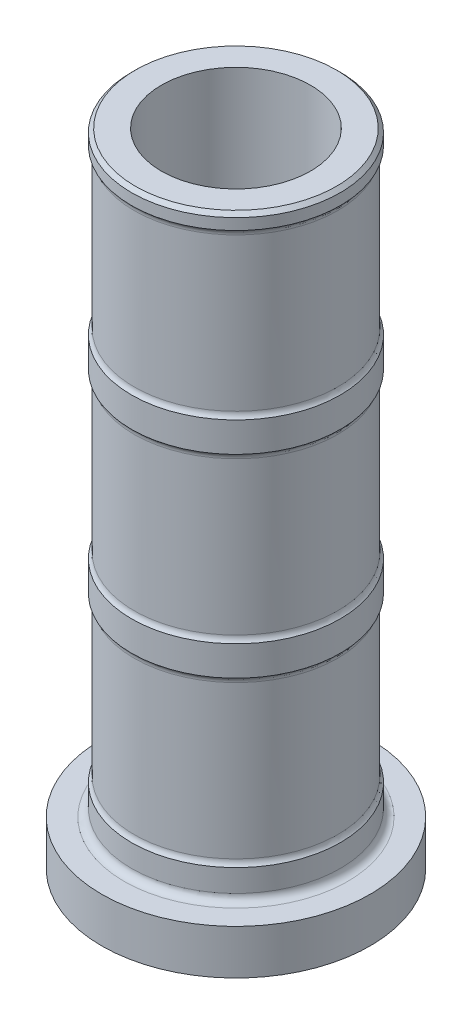
ISO-10303-21;
HEADER;
FILE_DESCRIPTION(('STEP AP214'),'2;1');
FILE_NAME('part.step','',(''),(''),'','','');
FILE_SCHEMA(('AUTOMOTIVE_DESIGN { 1 0 10303 214 1 1 1 1 }'));
ENDSEC;
DATA;
#1=APPLICATION_CONTEXT('core data for automotive mechanical design processes');
#2=APPLICATION_PROTOCOL_DEFINITION('international standard','automotive_design',2000,#1);
#3=PRODUCT_CONTEXT('',#1,'mechanical');
#4=PRODUCT('Part','Part','',(#3));
#5=PRODUCT_RELATED_PRODUCT_CATEGORY('part','',(#4));
#6=PRODUCT_DEFINITION_FORMATION('','',#4);
#7=PRODUCT_DEFINITION_CONTEXT('part definition',#1,'design');
#8=PRODUCT_DEFINITION('design','',#6,#7);
#9=PRODUCT_DEFINITION_SHAPE('','',#8);
#10=(LENGTH_UNIT() NAMED_UNIT(*) SI_UNIT(.MILLI.,.METRE.));
#11=(NAMED_UNIT(*) PLANE_ANGLE_UNIT() SI_UNIT($,.RADIAN.));
#12=(NAMED_UNIT(*) SI_UNIT($,.STERADIAN.) SOLID_ANGLE_UNIT());
#13=UNCERTAINTY_MEASURE_WITH_UNIT(LENGTH_MEASURE(1.E-05),#10,'distance_accuracy_value','');
#14=(GEOMETRIC_REPRESENTATION_CONTEXT(3) GLOBAL_UNCERTAINTY_ASSIGNED_CONTEXT((#13)) GLOBAL_UNIT_ASSIGNED_CONTEXT((#10,
#11,#12)) REPRESENTATION_CONTEXT('',''));
#15=CARTESIAN_POINT('',(0.,0.,0.));
#16=DIRECTION('',(0.,0.,1.));
#17=DIRECTION('',(1.,0.,0.));
#18=AXIS2_PLACEMENT_3D('',#15,#16,#17);
#19=CARTESIAN_POINT('',(0.,3.,0.));
#20=DIRECTION('',(0.,-1.,0.));
#21=DIRECTION('',(0.,0.,-1.));
#22=AXIS2_PLACEMENT_3D('',#19,#20,#21);
#23=CYLINDRICAL_SURFACE('',#22,9.);
#24=CARTESIAN_POINT('',(0.,3.,0.));
#25=DIRECTION('',(0.,1.,0.));
#26=DIRECTION('',(0.,0.,1.));
#27=AXIS2_PLACEMENT_3D('',#24,#25,#26);
#28=CIRCLE('',#27,9.);
#29=CARTESIAN_POINT('',(0.,3.,9.));
#30=VERTEX_POINT('',#29);
#31=EDGE_CURVE('E73',#30,#30,#28,.T.);
#32=ORIENTED_EDGE('',*,*,#31,.F.);
#33=EDGE_LOOP('',(#32));
#34=FACE_BOUND('',#33,.T.);
#35=CARTESIAN_POINT('',(0.,0.,0.));
#36=DIRECTION('',(0.,1.,0.));
#37=DIRECTION('',(0.,0.,1.));
#38=AXIS2_PLACEMENT_3D('',#35,#36,#37);
#39=CIRCLE('',#38,9.);
#40=CARTESIAN_POINT('',(0.,0.,9.));
#41=VERTEX_POINT('',#40);
#42=EDGE_CURVE('E74',#41,#41,#39,.T.);
#43=ORIENTED_EDGE('',*,*,#42,.T.);
#44=EDGE_LOOP('',(#43));
#45=FACE_BOUND('',#44,.T.);
#46=ADVANCED_FACE('F32',(#34,#45),#23,.T.);
#47=CARTESIAN_POINT('',(0.,3.,0.));
#48=DIRECTION('',(0.,1.,0.));
#49=DIRECTION('',(0.,0.,1.));
#50=AXIS2_PLACEMENT_3D('',#47,#48,#49);
#51=PLANE('',#50);
#52=CARTESIAN_POINT('',(0.,3.,0.));
#53=DIRECTION('',(0.,1.,0.));
#54=DIRECTION('',(0.,0.,1.));
#55=AXIS2_PLACEMENT_3D('',#52,#53,#54);
#56=CIRCLE('',#55,7.5);
#57=CARTESIAN_POINT('',(0.,3.,7.5));
#58=VERTEX_POINT('',#57);
#59=EDGE_CURVE('E47',#58,#58,#56,.F.);
#60=ORIENTED_EDGE('',*,*,#59,.T.);
#61=EDGE_LOOP('',(#60));
#62=FACE_BOUND('',#61,.T.);
#63=ORIENTED_EDGE('',*,*,#31,.T.);
#64=EDGE_LOOP('',(#63));
#65=FACE_BOUND('',#64,.T.);
#66=ADVANCED_FACE('F118',(#62,#65),#51,.T.);
#67=CARTESIAN_POINT('',(0.,0.,0.));
#68=DIRECTION('',(0.,1.,0.));
#69=DIRECTION('',(0.,0.,1.));
#70=AXIS2_PLACEMENT_3D('',#67,#68,#69);
#71=PLANE('',#70);
#72=CARTESIAN_POINT('',(0.,0.,0.));
#73=DIRECTION('',(0.,1.,0.));
#74=DIRECTION('',(0.,0.,1.));
#75=AXIS2_PLACEMENT_3D('',#72,#73,#74);
#76=CIRCLE('',#75,4.);
#77=CARTESIAN_POINT('',(0.,0.,4.));
#78=VERTEX_POINT('',#77);
#79=EDGE_CURVE('E100',#78,#78,#76,.F.);
#80=ORIENTED_EDGE('',*,*,#79,.F.);
#81=EDGE_LOOP('',(#80));
#82=FACE_BOUND('',#81,.T.);
#83=ORIENTED_EDGE('',*,*,#42,.F.);
#84=EDGE_LOOP('',(#83));
#85=FACE_BOUND('',#84,.T.);
#86=ADVANCED_FACE('F124',(#82,#85),#71,.F.);
#87=CARTESIAN_POINT('',(0.,5.,0.));
#88=DIRECTION('',(0.,-1.,0.));
#89=DIRECTION('',(0.,0.,-1.));
#90=AXIS2_PLACEMENT_3D('',#87,#88,#89);
#91=CYLINDRICAL_SURFACE('',#90,7.);
#92=CARTESIAN_POINT('',(0.,3.5,0.));
#93=DIRECTION('',(0.,1.,0.));
#94=DIRECTION('',(0.,0.,1.));
#95=AXIS2_PLACEMENT_3D('',#92,#93,#94);
#96=CIRCLE('',#95,7.);
#97=CARTESIAN_POINT('',(0.,3.5,7.));
#98=VERTEX_POINT('',#97);
#99=EDGE_CURVE('E52',#98,#98,#96,.T.);
#100=ORIENTED_EDGE('',*,*,#99,.T.);
#101=EDGE_LOOP('',(#100));
#102=FACE_BOUND('',#101,.T.);
#103=CARTESIAN_POINT('',(0.,5.,0.));
#104=DIRECTION('',(0.,1.,0.));
#105=DIRECTION('',(0.,0.,1.));
#106=AXIS2_PLACEMENT_3D('',#103,#104,#105);
#107=CIRCLE('',#106,7.);
#108=CARTESIAN_POINT('',(0.,5.,7.));
#109=VERTEX_POINT('',#108);
#110=EDGE_CURVE('E77',#109,#109,#107,.T.);
#111=ORIENTED_EDGE('',*,*,#110,.F.);
#112=EDGE_LOOP('',(#111));
#113=FACE_BOUND('',#112,.T.);
#114=ADVANCED_FACE('F201',(#102,#113),#91,.T.);
#115=CARTESIAN_POINT('',(0.,16.,0.));
#116=DIRECTION('',(0.,-1.,0.));
#117=DIRECTION('',(0.,0.,-1.));
#118=AXIS2_PLACEMENT_3D('',#115,#116,#117);
#119=CYLINDRICAL_SURFACE('',#118,6.825);
#120=CARTESIAN_POINT('',(0.,5.37996710383927,0.));
#121=DIRECTION('',(0.,-1.,0.));
#122=DIRECTION('',(0.,0.,-1.));
#123=AXIS2_PLACEMENT_3D('',#120,#121,#122);
#124=CIRCLE('',#123,6.825);
#125=CARTESIAN_POINT('',(0.,5.37996710383927,-6.825));
#126=VERTEX_POINT('',#125);
#127=EDGE_CURVE('E67',#126,#126,#124,.F.);
#128=ORIENTED_EDGE('',*,*,#127,.T.);
#129=EDGE_LOOP('',(#128));
#130=FACE_BOUND('',#129,.T.);
#131=CARTESIAN_POINT('',(0.,15.6200328961607,0.));
#132=DIRECTION('',(0.,1.,0.));
#133=DIRECTION('',(0.,0.,1.));
#134=AXIS2_PLACEMENT_3D('',#131,#132,#133);
#135=CIRCLE('',#134,6.825);
#136=CARTESIAN_POINT('',(0.,15.6200328961607,6.825));
#137=VERTEX_POINT('',#136);
#138=EDGE_CURVE('E70',#137,#137,#135,.F.);
#139=ORIENTED_EDGE('',*,*,#138,.T.);
#140=EDGE_LOOP('',(#139));
#141=FACE_BOUND('',#140,.T.);
#142=ADVANCED_FACE('F197',(#130,#141),#119,.T.);
#143=CARTESIAN_POINT('',(0.,18.,0.));
#144=DIRECTION('',(0.,-1.,0.));
#145=DIRECTION('',(0.,0.,-1.));
#146=AXIS2_PLACEMENT_3D('',#143,#144,#145);
#147=CYLINDRICAL_SURFACE('',#146,7.);
#148=CARTESIAN_POINT('',(0.,18.,0.));
#149=DIRECTION('',(0.,1.,0.));
#150=DIRECTION('',(0.,0.,1.));
#151=AXIS2_PLACEMENT_3D('',#148,#149,#150);
#152=CIRCLE('',#151,7.);
#153=CARTESIAN_POINT('',(0.,18.,7.));
#154=VERTEX_POINT('',#153);
#155=EDGE_CURVE('E82',#154,#154,#152,.T.);
#156=ORIENTED_EDGE('',*,*,#155,.F.);
#157=EDGE_LOOP('',(#156));
#158=FACE_BOUND('',#157,.T.);
#159=CARTESIAN_POINT('',(0.,16.,0.));
#160=DIRECTION('',(0.,1.,0.));
#161=DIRECTION('',(0.,0.,1.));
#162=AXIS2_PLACEMENT_3D('',#159,#160,#161);
#163=CIRCLE('',#162,7.);
#164=CARTESIAN_POINT('',(0.,16.,7.));
#165=VERTEX_POINT('',#164);
#166=EDGE_CURVE('E83',#165,#165,#163,.T.);
#167=ORIENTED_EDGE('',*,*,#166,.T.);
#168=EDGE_LOOP('',(#167));
#169=FACE_BOUND('',#168,.T.);
#170=ADVANCED_FACE('F193',(#158,#169),#147,.T.);
#171=CARTESIAN_POINT('',(0.,29.,0.));
#172=DIRECTION('',(0.,-1.,0.));
#173=DIRECTION('',(0.,0.,-1.));
#174=AXIS2_PLACEMENT_3D('',#171,#172,#173);
#175=CYLINDRICAL_SURFACE('',#174,6.825);
#176=CARTESIAN_POINT('',(0.,28.6200328961607,0.));
#177=DIRECTION('',(0.,1.,0.));
#178=DIRECTION('',(0.,0.,1.));
#179=AXIS2_PLACEMENT_3D('',#176,#177,#178);
#180=CIRCLE('',#179,6.825);
#181=CARTESIAN_POINT('',(0.,28.6200328961607,6.825));
#182=VERTEX_POINT('',#181);
#183=EDGE_CURVE('E55',#182,#182,#180,.F.);
#184=ORIENTED_EDGE('',*,*,#183,.T.);
#185=EDGE_LOOP('',(#184));
#186=FACE_BOUND('',#185,.T.);
#187=CARTESIAN_POINT('',(0.,18.3799671038393,0.));
#188=DIRECTION('',(0.,-1.,0.));
#189=DIRECTION('',(0.,0.,-1.));
#190=AXIS2_PLACEMENT_3D('',#187,#188,#189);
#191=CIRCLE('',#190,6.825);
#192=CARTESIAN_POINT('',(0.,18.3799671038393,-6.825));
#193=VERTEX_POINT('',#192);
#194=EDGE_CURVE('E58',#193,#193,#191,.F.);
#195=ORIENTED_EDGE('',*,*,#194,.T.);
#196=EDGE_LOOP('',(#195));
#197=FACE_BOUND('',#196,.T.);
#198=ADVANCED_FACE('F189',(#186,#197),#175,.T.);
#199=CARTESIAN_POINT('',(0.,31.,0.));
#200=DIRECTION('',(0.,-1.,0.));
#201=DIRECTION('',(0.,0.,-1.));
#202=AXIS2_PLACEMENT_3D('',#199,#200,#201);
#203=CYLINDRICAL_SURFACE('',#202,7.);
#204=CARTESIAN_POINT('',(0.,31.,0.));
#205=DIRECTION('',(0.,1.,0.));
#206=DIRECTION('',(0.,0.,1.));
#207=AXIS2_PLACEMENT_3D('',#204,#205,#206);
#208=CIRCLE('',#207,7.);
#209=CARTESIAN_POINT('',(0.,31.,7.));
#210=VERTEX_POINT('',#209);
#211=EDGE_CURVE('E86',#210,#210,#208,.T.);
#212=ORIENTED_EDGE('',*,*,#211,.F.);
#213=EDGE_LOOP('',(#212));
#214=FACE_BOUND('',#213,.T.);
#215=CARTESIAN_POINT('',(0.,29.,0.));
#216=DIRECTION('',(0.,1.,0.));
#217=DIRECTION('',(0.,0.,1.));
#218=AXIS2_PLACEMENT_3D('',#215,#216,#217);
#219=CIRCLE('',#218,7.);
#220=CARTESIAN_POINT('',(0.,29.,7.));
#221=VERTEX_POINT('',#220);
#222=EDGE_CURVE('E89',#221,#221,#219,.T.);
#223=ORIENTED_EDGE('',*,*,#222,.T.);
#224=EDGE_LOOP('',(#223));
#225=FACE_BOUND('',#224,.T.);
#226=ADVANCED_FACE('F185',(#214,#225),#203,.T.);
#227=CARTESIAN_POINT('',(0.,42.,0.));
#228=DIRECTION('',(0.,-1.,0.));
#229=DIRECTION('',(0.,0.,-1.));
#230=AXIS2_PLACEMENT_3D('',#227,#228,#229);
#231=CYLINDRICAL_SURFACE('',#230,6.825);
#232=CARTESIAN_POINT('',(0.,41.6200328961607,0.));
#233=DIRECTION('',(0.,1.,0.));
#234=DIRECTION('',(0.,0.,1.));
#235=AXIS2_PLACEMENT_3D('',#232,#233,#234);
#236=CIRCLE('',#235,6.825);
#237=CARTESIAN_POINT('',(0.,41.6200328961607,6.825));
#238=VERTEX_POINT('',#237);
#239=EDGE_CURVE('E61',#238,#238,#236,.F.);
#240=ORIENTED_EDGE('',*,*,#239,.T.);
#241=EDGE_LOOP('',(#240));
#242=FACE_BOUND('',#241,.T.);
#243=CARTESIAN_POINT('',(0.,31.3799671038393,0.));
#244=DIRECTION('',(0.,-1.,0.));
#245=DIRECTION('',(0.,0.,-1.));
#246=AXIS2_PLACEMENT_3D('',#243,#244,#245);
#247=CIRCLE('',#246,6.825);
#248=CARTESIAN_POINT('',(0.,31.3799671038393,-6.825));
#249=VERTEX_POINT('',#248);
#250=EDGE_CURVE('E64',#249,#249,#247,.F.);
#251=ORIENTED_EDGE('',*,*,#250,.T.);
#252=EDGE_LOOP('',(#251));
#253=FACE_BOUND('',#252,.T.);
#254=ADVANCED_FACE('F179',(#242,#253),#231,.T.);
#255=CARTESIAN_POINT('',(0.,43.,0.));
#256=DIRECTION('',(0.,-1.,0.));
#257=DIRECTION('',(0.,0.,-1.));
#258=AXIS2_PLACEMENT_3D('',#255,#256,#257);
#259=CYLINDRICAL_SURFACE('',#258,7.);
#260=CARTESIAN_POINT('',(0.,42.75,0.));
#261=DIRECTION('',(0.,1.,0.));
#262=DIRECTION('',(0.,0.,1.));
#263=AXIS2_PLACEMENT_3D('',#260,#261,#262);
#264=CIRCLE('',#263,7.);
#265=CARTESIAN_POINT('',(0.,42.75,7.));
#266=VERTEX_POINT('',#265);
#267=EDGE_CURVE('E39',#266,#266,#264,.F.);
#268=ORIENTED_EDGE('',*,*,#267,.T.);
#269=EDGE_LOOP('',(#268));
#270=FACE_BOUND('',#269,.T.);
#271=CARTESIAN_POINT('',(0.,42.,0.));
#272=DIRECTION('',(0.,1.,0.));
#273=DIRECTION('',(0.,0.,1.));
#274=AXIS2_PLACEMENT_3D('',#271,#272,#273);
#275=CIRCLE('',#274,7.);
#276=CARTESIAN_POINT('',(0.,42.,7.));
#277=VERTEX_POINT('',#276);
#278=EDGE_CURVE('E92',#277,#277,#275,.T.);
#279=ORIENTED_EDGE('',*,*,#278,.T.);
#280=EDGE_LOOP('',(#279));
#281=FACE_BOUND('',#280,.T.);
#282=ADVANCED_FACE('F173',(#270,#281),#259,.T.);
#283=CARTESIAN_POINT('',(0.,43.,0.));
#284=DIRECTION('',(0.,1.,0.));
#285=DIRECTION('',(0.,0.,1.));
#286=AXIS2_PLACEMENT_3D('',#283,#284,#285);
#287=PLANE('',#286);
#288=CARTESIAN_POINT('',(0.,43.,0.));
#289=DIRECTION('',(0.,1.,0.));
#290=DIRECTION('',(0.,0.,1.));
#291=AXIS2_PLACEMENT_3D('',#288,#289,#290);
#292=CIRCLE('',#291,5.);
#293=CARTESIAN_POINT('',(0.,43.,5.));
#294=VERTEX_POINT('',#293);
#295=EDGE_CURVE('E97',#294,#294,#292,.T.);
#296=ORIENTED_EDGE('',*,*,#295,.F.);
#297=EDGE_LOOP('',(#296));
#298=FACE_BOUND('',#297,.T.);
#299=CARTESIAN_POINT('',(0.,43.,0.));
#300=DIRECTION('',(0.,1.,0.));
#301=DIRECTION('',(0.,0.,1.));
#302=AXIS2_PLACEMENT_3D('',#299,#300,#301);
#303=CIRCLE('',#302,6.75000000000001);
#304=CARTESIAN_POINT('',(0.,43.,6.75000000000001));
#305=VERTEX_POINT('',#304);
#306=EDGE_CURVE('E43',#305,#305,#303,.T.);
#307=ORIENTED_EDGE('',*,*,#306,.T.);
#308=EDGE_LOOP('',(#307));
#309=FACE_BOUND('',#308,.T.);
#310=ADVANCED_FACE('F135',(#298,#309),#287,.T.);
#311=CARTESIAN_POINT('',(0.,5.37996710383927,0.));
#312=DIRECTION('',(0.,-1.,0.));
#313=DIRECTION('',(0.,0.,-1.));
#314=AXIS2_PLACEMENT_3D('',#311,#312,#313);
#315=TOROIDAL_SURFACE('',#314,7.325,0.5);
#316=ORIENTED_EDGE('',*,*,#110,.T.);
#317=EDGE_LOOP('',(#316));
#318=FACE_BOUND('',#317,.T.);
#319=ORIENTED_EDGE('',*,*,#127,.F.);
#320=EDGE_LOOP('',(#319));
#321=FACE_BOUND('',#320,.T.);
#322=ADVANCED_FACE('F131',(#318,#321),#315,.F.);
#323=CARTESIAN_POINT('',(0.,15.6200328961607,0.));
#324=DIRECTION('',(0.,1.,0.));
#325=DIRECTION('',(0.,0.,1.));
#326=AXIS2_PLACEMENT_3D('',#323,#324,#325);
#327=TOROIDAL_SURFACE('',#326,7.325,0.5);
#328=ORIENTED_EDGE('',*,*,#138,.F.);
#329=EDGE_LOOP('',(#328));
#330=FACE_BOUND('',#329,.T.);
#331=ORIENTED_EDGE('',*,*,#166,.F.);
#332=EDGE_LOOP('',(#331));
#333=FACE_BOUND('',#332,.T.);
#334=ADVANCED_FACE('F134',(#330,#333),#327,.F.);
#335=CARTESIAN_POINT('',(0.,41.6200328961607,0.));
#336=DIRECTION('',(0.,1.,0.));
#337=DIRECTION('',(0.,0.,1.));
#338=AXIS2_PLACEMENT_3D('',#335,#336,#337);
#339=TOROIDAL_SURFACE('',#338,7.325,0.5);
#340=ORIENTED_EDGE('',*,*,#239,.F.);
#341=EDGE_LOOP('',(#340));
#342=FACE_BOUND('',#341,.T.);
#343=ORIENTED_EDGE('',*,*,#278,.F.);
#344=EDGE_LOOP('',(#343));
#345=FACE_BOUND('',#344,.T.);
#346=ADVANCED_FACE('F139',(#342,#345),#339,.F.);
#347=CARTESIAN_POINT('',(0.,31.3799671038393,0.));
#348=DIRECTION('',(0.,-1.,0.));
#349=DIRECTION('',(0.,0.,-1.));
#350=AXIS2_PLACEMENT_3D('',#347,#348,#349);
#351=TOROIDAL_SURFACE('',#350,7.325,0.5);
#352=ORIENTED_EDGE('',*,*,#211,.T.);
#353=EDGE_LOOP('',(#352));
#354=FACE_BOUND('',#353,.T.);
#355=ORIENTED_EDGE('',*,*,#250,.F.);
#356=EDGE_LOOP('',(#355));
#357=FACE_BOUND('',#356,.T.);
#358=ADVANCED_FACE('F143',(#354,#357),#351,.F.);
#359=CARTESIAN_POINT('',(0.,28.6200328961607,0.));
#360=DIRECTION('',(0.,1.,0.));
#361=DIRECTION('',(0.,0.,1.));
#362=AXIS2_PLACEMENT_3D('',#359,#360,#361);
#363=TOROIDAL_SURFACE('',#362,7.325,0.5);
#364=ORIENTED_EDGE('',*,*,#183,.F.);
#365=EDGE_LOOP('',(#364));
#366=FACE_BOUND('',#365,.T.);
#367=ORIENTED_EDGE('',*,*,#222,.F.);
#368=EDGE_LOOP('',(#367));
#369=FACE_BOUND('',#368,.T.);
#370=ADVANCED_FACE('F147',(#366,#369),#363,.F.);
#371=CARTESIAN_POINT('',(0.,18.3799671038393,0.));
#372=DIRECTION('',(0.,-1.,0.));
#373=DIRECTION('',(0.,0.,-1.));
#374=AXIS2_PLACEMENT_3D('',#371,#372,#373);
#375=TOROIDAL_SURFACE('',#374,7.325,0.5);
#376=ORIENTED_EDGE('',*,*,#155,.T.);
#377=EDGE_LOOP('',(#376));
#378=FACE_BOUND('',#377,.T.);
#379=ORIENTED_EDGE('',*,*,#194,.F.);
#380=EDGE_LOOP('',(#379));
#381=FACE_BOUND('',#380,.T.);
#382=ADVANCED_FACE('F151',(#378,#381),#375,.F.);
#383=CARTESIAN_POINT('',(0.,3.5,0.));
#384=DIRECTION('',(0.,1.,0.));
#385=DIRECTION('',(0.,0.,1.));
#386=AXIS2_PLACEMENT_3D('',#383,#384,#385);
#387=TOROIDAL_SURFACE('',#386,7.5,0.5);
#388=ORIENTED_EDGE('',*,*,#59,.F.);
#389=EDGE_LOOP('',(#388));
#390=FACE_BOUND('',#389,.T.);
#391=ORIENTED_EDGE('',*,*,#99,.F.);
#392=EDGE_LOOP('',(#391));
#393=FACE_BOUND('',#392,.T.);
#394=ADVANCED_FACE('F155',(#390,#393),#387,.F.);
#395=CARTESIAN_POINT('',(0.,43.,0.));
#396=DIRECTION('',(0.,-1.,0.));
#397=DIRECTION('',(0.,0.,-1.));
#398=AXIS2_PLACEMENT_3D('',#395,#396,#397);
#399=CONICAL_SURFACE('',#398,6.75000000000001,0.785398163397436);
#400=ORIENTED_EDGE('',*,*,#267,.F.);
#401=EDGE_LOOP('',(#400));
#402=FACE_BOUND('',#401,.T.);
#403=ORIENTED_EDGE('',*,*,#306,.F.);
#404=EDGE_LOOP('',(#403));
#405=FACE_BOUND('',#404,.T.);
#406=ADVANCED_FACE('F158',(#402,#405),#399,.T.);
#407=CARTESIAN_POINT('',(0.,28.,0.));
#408=DIRECTION('',(0.,1.,0.));
#409=DIRECTION('',(0.,0.,1.));
#410=AXIS2_PLACEMENT_3D('',#407,#408,#409);
#411=CYLINDRICAL_SURFACE('',#410,5.);
#412=CARTESIAN_POINT('',(0.,29.,0.));
#413=DIRECTION('',(0.,1.,0.));
#414=DIRECTION('',(0.,0.,1.));
#415=AXIS2_PLACEMENT_3D('',#412,#413,#414);
#416=CIRCLE('',#415,5.);
#417=CARTESIAN_POINT('',(0.,29.,5.));
#418=VERTEX_POINT('',#417);
#419=EDGE_CURVE('E10',#418,#418,#416,.F.);
#420=ORIENTED_EDGE('',*,*,#419,.T.);
#421=EDGE_LOOP('',(#420));
#422=FACE_BOUND('',#421,.T.);
#423=ORIENTED_EDGE('',*,*,#295,.T.);
#424=EDGE_LOOP('',(#423));
#425=FACE_BOUND('',#424,.T.);
#426=ADVANCED_FACE('F114',(#422,#425),#411,.F.);
#427=CARTESIAN_POINT('',(0.,-11.3137084989848,0.));
#428=DIRECTION('',(0.,1.,0.));
#429=DIRECTION('',(0.,0.,1.));
#430=AXIS2_PLACEMENT_3D('',#427,#428,#429);
#431=CYLINDRICAL_SURFACE('',#430,4.);
#432=ORIENTED_EDGE('',*,*,#79,.T.);
#433=EDGE_LOOP('',(#432));
#434=FACE_BOUND('',#433,.T.);
#435=CARTESIAN_POINT('',(0.,28.,0.));
#436=DIRECTION('',(0.,1.,0.));
#437=DIRECTION('',(0.,0.,1.));
#438=AXIS2_PLACEMENT_3D('',#435,#436,#437);
#439=CIRCLE('',#438,4.);
#440=CARTESIAN_POINT('',(0.,28.,4.));
#441=VERTEX_POINT('',#440);
#442=EDGE_CURVE('E103',#441,#441,#439,.T.);
#443=ORIENTED_EDGE('',*,*,#442,.T.);
#444=EDGE_LOOP('',(#443));
#445=FACE_BOUND('',#444,.T.);
#446=ADVANCED_FACE('F107',(#434,#445),#431,.F.);
#447=CARTESIAN_POINT('',(0.,29.,0.));
#448=DIRECTION('',(0.,1.,0.));
#449=DIRECTION('',(0.,0.,1.));
#450=AXIS2_PLACEMENT_3D('',#447,#448,#449);
#451=TOROIDAL_SURFACE('',#450,4.,1.);
#452=ORIENTED_EDGE('',*,*,#419,.F.);
#453=EDGE_LOOP('',(#452));
#454=FACE_BOUND('',#453,.T.);
#455=ORIENTED_EDGE('',*,*,#442,.F.);
#456=EDGE_LOOP('',(#455));
#457=FACE_BOUND('',#456,.T.);
#458=ADVANCED_FACE('F34',(#454,#457),#451,.F.);
#459=CLOSED_SHELL('',(#46,#66,#86,#114,#142,#170,#198,#226,#254,#282,#310,#322,#334,#346,#358,
#370,#382,#394,#406,#426,#446,#458));
#460=MANIFOLD_SOLID_BREP('B2',#459);
#461=ADVANCED_BREP_SHAPE_REPRESENTATION('',(#18,#460),#14);
#462=SHAPE_DEFINITION_REPRESENTATION(#9,#461);
ENDSEC;
END-ISO-10303-21;
